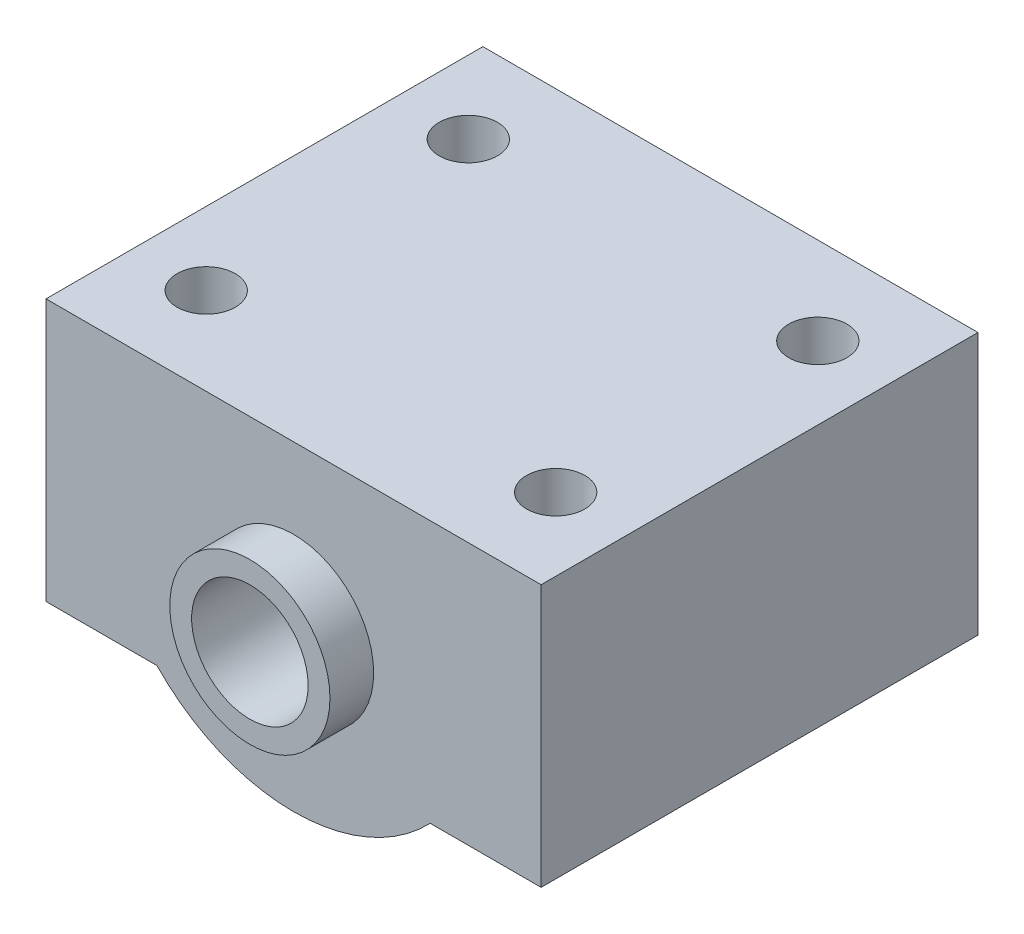
ISO-10303-21;
HEADER;
FILE_DESCRIPTION(('STEP AP214'),'2;1');
FILE_NAME('part.step','',(''),(''),'','','');
FILE_SCHEMA(('AUTOMOTIVE_DESIGN { 1 0 10303 214 1 1 1 1 }'));
ENDSEC;
DATA;
#1=APPLICATION_CONTEXT('core data for automotive mechanical design processes');
#2=APPLICATION_PROTOCOL_DEFINITION('international standard','automotive_design',2000,#1);
#3=PRODUCT_CONTEXT('',#1,'mechanical');
#4=PRODUCT('Part','Part','',(#3));
#5=PRODUCT_RELATED_PRODUCT_CATEGORY('part','',(#4));
#6=PRODUCT_DEFINITION_FORMATION('','',#4);
#7=PRODUCT_DEFINITION_CONTEXT('part definition',#1,'design');
#8=PRODUCT_DEFINITION('design','',#6,#7);
#9=PRODUCT_DEFINITION_SHAPE('','',#8);
#10=(LENGTH_UNIT() NAMED_UNIT(*) SI_UNIT(.MILLI.,.METRE.));
#11=(NAMED_UNIT(*) PLANE_ANGLE_UNIT() SI_UNIT($,.RADIAN.));
#12=(NAMED_UNIT(*) SI_UNIT($,.STERADIAN.) SOLID_ANGLE_UNIT());
#13=UNCERTAINTY_MEASURE_WITH_UNIT(LENGTH_MEASURE(1.E-05),#10,'distance_accuracy_value','');
#14=(GEOMETRIC_REPRESENTATION_CONTEXT(3) GLOBAL_UNCERTAINTY_ASSIGNED_CONTEXT((#13)) GLOBAL_UNIT_ASSIGNED_CONTEXT((#10,
#11,#12)) REPRESENTATION_CONTEXT('',''));
#15=CARTESIAN_POINT('',(0.,0.,0.));
#16=DIRECTION('',(0.,0.,1.));
#17=DIRECTION('',(1.,0.,0.));
#18=AXIS2_PLACEMENT_3D('',#15,#16,#17);
#19=CARTESIAN_POINT('',(0.,0.,0.));
#20=DIRECTION('',(0.,0.,1.));
#21=DIRECTION('',(1.,0.,0.));
#22=AXIS2_PLACEMENT_3D('',#19,#20,#21);
#23=PLANE('',#22);
#24=DIRECTION('',(0.,-1.,0.));
#25=VECTOR('',#24,1.);
#26=CARTESIAN_POINT('',(-17.,-9.,0.));
#27=LINE('',#26,#25);
#28=CARTESIAN_POINT('',(-17.,9.,0.));
#29=VERTEX_POINT('',#28);
#30=CARTESIAN_POINT('',(-17.,-9.,0.));
#31=VERTEX_POINT('',#30);
#32=EDGE_CURVE('E123',#29,#31,#27,.T.);
#33=ORIENTED_EDGE('',*,*,#32,.F.);
#34=DIRECTION('',(-1.,0.,0.));
#35=VECTOR('',#34,1.);
#36=CARTESIAN_POINT('',(17.,9.,0.));
#37=LINE('',#36,#35);
#38=CARTESIAN_POINT('',(17.,9.,0.));
#39=VERTEX_POINT('',#38);
#40=EDGE_CURVE('E82',#39,#29,#37,.T.);
#41=ORIENTED_EDGE('',*,*,#40,.F.);
#42=DIRECTION('',(0.,1.,0.));
#43=VECTOR('',#42,1.);
#44=CARTESIAN_POINT('',(17.,-9.,0.));
#45=LINE('',#44,#43);
#46=CARTESIAN_POINT('',(17.,-9.,0.));
#47=VERTEX_POINT('',#46);
#48=EDGE_CURVE('E76',#47,#39,#45,.T.);
#49=ORIENTED_EDGE('',*,*,#48,.F.);
#50=DIRECTION('',(1.,0.,0.));
#51=VECTOR('',#50,1.);
#52=CARTESIAN_POINT('',(17.,-9.,0.));
#53=LINE('',#52,#51);
#54=CARTESIAN_POINT('',(9.38083151964686,-9.,0.));
#55=VERTEX_POINT('',#54);
#56=EDGE_CURVE('E113',#55,#47,#53,.T.);
#57=ORIENTED_EDGE('',*,*,#56,.F.);
#58=CARTESIAN_POINT('',(0.,0.,0.));
#59=DIRECTION('',(0.,0.,1.));
#60=DIRECTION('',(1.,0.,0.));
#61=AXIS2_PLACEMENT_3D('',#58,#59,#60);
#62=CIRCLE('',#61,13.);
#63=CARTESIAN_POINT('',(-9.38083151964686,-9.,0.));
#64=VERTEX_POINT('',#63);
#65=EDGE_CURVE('E129',#64,#55,#62,.T.);
#66=ORIENTED_EDGE('',*,*,#65,.F.);
#67=DIRECTION('',(1.,0.,0.));
#68=VECTOR('',#67,1.);
#69=CARTESIAN_POINT('',(-9.38083151964685,-9.,0.));
#70=LINE('',#69,#68);
#71=EDGE_CURVE('E126',#31,#64,#70,.T.);
#72=ORIENTED_EDGE('',*,*,#71,.F.);
#73=EDGE_LOOP('',(#33,#41,#49,#57,#66,#72));
#74=FACE_BOUND('',#73,.T.);
#75=CARTESIAN_POINT('',(0.,-2.,0.));
#76=DIRECTION('',(0.,0.,1.));
#77=DIRECTION('',(1.,0.,0.));
#78=AXIS2_PLACEMENT_3D('',#75,#76,#77);
#79=CIRCLE('',#78,5.5);
#80=CARTESIAN_POINT('',(5.5,-2.,0.));
#81=VERTEX_POINT('',#80);
#82=EDGE_CURVE('E11',#81,#81,#79,.F.);
#83=ORIENTED_EDGE('',*,*,#82,.F.);
#84=EDGE_LOOP('',(#83));
#85=FACE_BOUND('',#84,.T.);
#86=ADVANCED_FACE('F36',(#74,#85),#23,.F.);
#87=CARTESIAN_POINT('',(0.,0.,30.));
#88=DIRECTION('',(0.,0.,1.));
#89=DIRECTION('',(1.,0.,0.));
#90=AXIS2_PLACEMENT_3D('',#87,#88,#89);
#91=PLANE('',#90);
#92=DIRECTION('',(0.,-1.,0.));
#93=VECTOR('',#92,1.);
#94=CARTESIAN_POINT('',(-17.,-9.,30.));
#95=LINE('',#94,#93);
#96=CARTESIAN_POINT('',(-17.,9.,30.));
#97=VERTEX_POINT('',#96);
#98=CARTESIAN_POINT('',(-17.,-9.,30.));
#99=VERTEX_POINT('',#98);
#100=EDGE_CURVE('E134',#97,#99,#95,.T.);
#101=ORIENTED_EDGE('',*,*,#100,.T.);
#102=DIRECTION('',(1.,0.,0.));
#103=VECTOR('',#102,1.);
#104=CARTESIAN_POINT('',(-9.38083151964685,-9.,30.));
#105=LINE('',#104,#103);
#106=CARTESIAN_POINT('',(-9.38083151964686,-9.,30.));
#107=VERTEX_POINT('',#106);
#108=EDGE_CURVE('E91',#99,#107,#105,.T.);
#109=ORIENTED_EDGE('',*,*,#108,.T.);
#110=CARTESIAN_POINT('',(0.,0.,30.));
#111=DIRECTION('',(0.,0.,1.));
#112=DIRECTION('',(1.,0.,0.));
#113=AXIS2_PLACEMENT_3D('',#110,#111,#112);
#114=CIRCLE('',#113,13.);
#115=CARTESIAN_POINT('',(9.38083151964686,-9.,30.));
#116=VERTEX_POINT('',#115);
#117=EDGE_CURVE('E105',#107,#116,#114,.T.);
#118=ORIENTED_EDGE('',*,*,#117,.T.);
#119=DIRECTION('',(1.,0.,0.));
#120=VECTOR('',#119,1.);
#121=CARTESIAN_POINT('',(17.,-9.,30.));
#122=LINE('',#121,#120);
#123=CARTESIAN_POINT('',(17.,-9.,30.));
#124=VERTEX_POINT('',#123);
#125=EDGE_CURVE('E98',#116,#124,#122,.T.);
#126=ORIENTED_EDGE('',*,*,#125,.T.);
#127=DIRECTION('',(0.,1.,0.));
#128=VECTOR('',#127,1.);
#129=CARTESIAN_POINT('',(17.,-9.,30.));
#130=LINE('',#129,#128);
#131=CARTESIAN_POINT('',(17.,9.,30.));
#132=VERTEX_POINT('',#131);
#133=EDGE_CURVE('E103',#124,#132,#130,.T.);
#134=ORIENTED_EDGE('',*,*,#133,.T.);
#135=DIRECTION('',(-1.,0.,0.));
#136=VECTOR('',#135,1.);
#137=CARTESIAN_POINT('',(17.,9.,30.));
#138=LINE('',#137,#136);
#139=EDGE_CURVE('E53',#132,#97,#138,.T.);
#140=ORIENTED_EDGE('',*,*,#139,.T.);
#141=EDGE_LOOP('',(#101,#109,#118,#126,#134,#140));
#142=FACE_BOUND('',#141,.T.);
#143=CARTESIAN_POINT('',(0.,-2.,30.));
#144=DIRECTION('',(0.,0.,1.));
#145=DIRECTION('',(1.,0.,0.));
#146=AXIS2_PLACEMENT_3D('',#143,#144,#145);
#147=CIRCLE('',#146,5.5);
#148=CARTESIAN_POINT('',(5.5,-2.,30.));
#149=VERTEX_POINT('',#148);
#150=EDGE_CURVE('E153',#149,#149,#147,.T.);
#151=ORIENTED_EDGE('',*,*,#150,.F.);
#152=EDGE_LOOP('',(#151));
#153=FACE_BOUND('',#152,.T.);
#154=ADVANCED_FACE('F100',(#142,#153),#91,.T.);
#155=CARTESIAN_POINT('',(-17.,-9.,30.));
#156=DIRECTION('',(1.,0.,0.));
#157=DIRECTION('',(0.,0.,-1.));
#158=AXIS2_PLACEMENT_3D('',#155,#156,#157);
#159=PLANE('',#158);
#160=ORIENTED_EDGE('',*,*,#32,.T.);
#161=DIRECTION('',(0.,0.,-1.));
#162=VECTOR('',#161,1.);
#163=CARTESIAN_POINT('',(-17.,-9.,30.));
#164=LINE('',#163,#162);
#165=EDGE_CURVE('E45',#99,#31,#164,.T.);
#166=ORIENTED_EDGE('',*,*,#165,.F.);
#167=ORIENTED_EDGE('',*,*,#100,.F.);
#168=DIRECTION('',(0.,0.,-1.));
#169=VECTOR('',#168,1.);
#170=CARTESIAN_POINT('',(-17.,9.,30.));
#171=LINE('',#170,#169);
#172=EDGE_CURVE('E119',#97,#29,#171,.T.);
#173=ORIENTED_EDGE('',*,*,#172,.T.);
#174=EDGE_LOOP('',(#160,#166,#167,#173));
#175=FACE_BOUND('',#174,.T.);
#176=ADVANCED_FACE('F38',(#175),#159,.F.);
#177=CARTESIAN_POINT('',(-9.38083151964685,-9.,30.));
#178=DIRECTION('',(0.,1.,0.));
#179=DIRECTION('',(0.,0.,1.));
#180=AXIS2_PLACEMENT_3D('',#177,#178,#179);
#181=PLANE('',#180);
#182=CARTESIAN_POINT('',(-12.,-9.,3.));
#183=DIRECTION('',(0.,-1.,0.));
#184=DIRECTION('',(0.,0.,1.));
#185=AXIS2_PLACEMENT_3D('',#182,#183,#184);
#186=CIRCLE('',#185,1.7);
#187=CARTESIAN_POINT('',(-12.,-9.,4.7));
#188=VERTEX_POINT('',#187);
#189=EDGE_CURVE('E210',#188,#188,#186,.T.);
#190=ORIENTED_EDGE('',*,*,#189,.F.);
#191=EDGE_LOOP('',(#190));
#192=FACE_BOUND('',#191,.T.);
#193=CARTESIAN_POINT('',(-12.,-9.,27.));
#194=DIRECTION('',(0.,-1.,0.));
#195=DIRECTION('',(0.,0.,-1.));
#196=AXIS2_PLACEMENT_3D('',#193,#194,#195);
#197=CIRCLE('',#196,1.7);
#198=CARTESIAN_POINT('',(-12.,-9.,25.3));
#199=VERTEX_POINT('',#198);
#200=EDGE_CURVE('E192',#199,#199,#197,.T.);
#201=ORIENTED_EDGE('',*,*,#200,.F.);
#202=EDGE_LOOP('',(#201));
#203=FACE_BOUND('',#202,.T.);
#204=ORIENTED_EDGE('',*,*,#71,.T.);
#205=DIRECTION('',(0.,0.,-1.));
#206=VECTOR('',#205,1.);
#207=CARTESIAN_POINT('',(-9.38083151964686,-9.,30.));
#208=LINE('',#207,#206);
#209=EDGE_CURVE('E138',#107,#64,#208,.T.);
#210=ORIENTED_EDGE('',*,*,#209,.F.);
#211=ORIENTED_EDGE('',*,*,#108,.F.);
#212=ORIENTED_EDGE('',*,*,#165,.T.);
#213=EDGE_LOOP('',(#204,#210,#211,#212));
#214=FACE_BOUND('',#213,.T.);
#215=ADVANCED_FACE('F141',(#192,#203,#214),#181,.F.);
#216=CARTESIAN_POINT('',(0.,0.,30.));
#217=DIRECTION('',(0.,0.,-1.));
#218=DIRECTION('',(-1.,0.,0.));
#219=AXIS2_PLACEMENT_3D('',#216,#217,#218);
#220=CYLINDRICAL_SURFACE('',#219,13.);
#221=ORIENTED_EDGE('',*,*,#65,.T.);
#222=DIRECTION('',(0.,0.,-1.));
#223=VECTOR('',#222,1.);
#224=CARTESIAN_POINT('',(9.38083151964686,-9.,30.));
#225=LINE('',#224,#223);
#226=EDGE_CURVE('E114',#116,#55,#225,.T.);
#227=ORIENTED_EDGE('',*,*,#226,.F.);
#228=ORIENTED_EDGE('',*,*,#117,.F.);
#229=ORIENTED_EDGE('',*,*,#209,.T.);
#230=EDGE_LOOP('',(#221,#227,#228,#229));
#231=FACE_BOUND('',#230,.T.);
#232=ADVANCED_FACE('F149',(#231),#220,.T.);
#233=CARTESIAN_POINT('',(17.,-9.,30.));
#234=DIRECTION('',(0.,1.,0.));
#235=DIRECTION('',(-1.,0.,0.));
#236=AXIS2_PLACEMENT_3D('',#233,#234,#235);
#237=PLANE('',#236);
#238=CARTESIAN_POINT('',(12.,-9.,27.));
#239=DIRECTION('',(0.,-1.,0.));
#240=DIRECTION('',(0.,0.,1.));
#241=AXIS2_PLACEMENT_3D('',#238,#239,#240);
#242=CIRCLE('',#241,1.7);
#243=CARTESIAN_POINT('',(12.,-9.,28.7));
#244=VERTEX_POINT('',#243);
#245=EDGE_CURVE('E198',#244,#244,#242,.T.);
#246=ORIENTED_EDGE('',*,*,#245,.F.);
#247=EDGE_LOOP('',(#246));
#248=FACE_BOUND('',#247,.T.);
#249=CARTESIAN_POINT('',(12.,-9.,3.));
#250=DIRECTION('',(0.,-1.,0.));
#251=DIRECTION('',(0.,0.,-1.));
#252=AXIS2_PLACEMENT_3D('',#249,#250,#251);
#253=CIRCLE('',#252,1.7);
#254=CARTESIAN_POINT('',(12.,-9.,1.3));
#255=VERTEX_POINT('',#254);
#256=EDGE_CURVE('E204',#255,#255,#253,.T.);
#257=ORIENTED_EDGE('',*,*,#256,.F.);
#258=EDGE_LOOP('',(#257));
#259=FACE_BOUND('',#258,.T.);
#260=ORIENTED_EDGE('',*,*,#56,.T.);
#261=DIRECTION('',(0.,0.,-1.));
#262=VECTOR('',#261,1.);
#263=CARTESIAN_POINT('',(17.,-9.,30.));
#264=LINE('',#263,#262);
#265=EDGE_CURVE('E110',#124,#47,#264,.T.);
#266=ORIENTED_EDGE('',*,*,#265,.F.);
#267=ORIENTED_EDGE('',*,*,#125,.F.);
#268=ORIENTED_EDGE('',*,*,#226,.T.);
#269=EDGE_LOOP('',(#260,#266,#267,#268));
#270=FACE_BOUND('',#269,.T.);
#271=ADVANCED_FACE('F111',(#248,#259,#270),#237,.F.);
#272=CARTESIAN_POINT('',(17.,-9.,30.));
#273=DIRECTION('',(-1.,0.,0.));
#274=DIRECTION('',(0.,0.,1.));
#275=AXIS2_PLACEMENT_3D('',#272,#273,#274);
#276=PLANE('',#275);
#277=ORIENTED_EDGE('',*,*,#48,.T.);
#278=DIRECTION('',(0.,0.,-1.));
#279=VECTOR('',#278,1.);
#280=CARTESIAN_POINT('',(17.,9.,30.));
#281=LINE('',#280,#279);
#282=EDGE_CURVE('E115',#132,#39,#281,.T.);
#283=ORIENTED_EDGE('',*,*,#282,.F.);
#284=ORIENTED_EDGE('',*,*,#133,.F.);
#285=ORIENTED_EDGE('',*,*,#265,.T.);
#286=EDGE_LOOP('',(#277,#283,#284,#285));
#287=FACE_BOUND('',#286,.T.);
#288=ADVANCED_FACE('F117',(#287),#276,.F.);
#289=CARTESIAN_POINT('',(17.,9.,30.));
#290=DIRECTION('',(0.,-1.,0.));
#291=DIRECTION('',(1.,0.,0.));
#292=AXIS2_PLACEMENT_3D('',#289,#290,#291);
#293=PLANE('',#292);
#294=CARTESIAN_POINT('',(12.,9.,6.));
#295=DIRECTION('',(0.,1.,0.));
#296=DIRECTION('',(1.,0.,0.));
#297=AXIS2_PLACEMENT_3D('',#294,#295,#296);
#298=CIRCLE('',#297,2.);
#299=CARTESIAN_POINT('',(14.,9.,6.));
#300=VERTEX_POINT('',#299);
#301=EDGE_CURVE('E174',#300,#300,#298,.T.);
#302=ORIENTED_EDGE('',*,*,#301,.F.);
#303=EDGE_LOOP('',(#302));
#304=FACE_BOUND('',#303,.T.);
#305=CARTESIAN_POINT('',(12.,9.,24.));
#306=DIRECTION('',(0.,1.,0.));
#307=DIRECTION('',(-1.,0.,0.));
#308=AXIS2_PLACEMENT_3D('',#305,#306,#307);
#309=CIRCLE('',#308,2.);
#310=CARTESIAN_POINT('',(10.,9.,24.));
#311=VERTEX_POINT('',#310);
#312=EDGE_CURVE('E181',#311,#311,#309,.T.);
#313=ORIENTED_EDGE('',*,*,#312,.F.);
#314=EDGE_LOOP('',(#313));
#315=FACE_BOUND('',#314,.T.);
#316=CARTESIAN_POINT('',(-12.,9.,24.));
#317=DIRECTION('',(0.,1.,0.));
#318=DIRECTION('',(1.,0.,0.));
#319=AXIS2_PLACEMENT_3D('',#316,#317,#318);
#320=CIRCLE('',#319,2.);
#321=CARTESIAN_POINT('',(-10.,9.,24.));
#322=VERTEX_POINT('',#321);
#323=EDGE_CURVE('E187',#322,#322,#320,.T.);
#324=ORIENTED_EDGE('',*,*,#323,.F.);
#325=EDGE_LOOP('',(#324));
#326=FACE_BOUND('',#325,.T.);
#327=CARTESIAN_POINT('',(-12.,9.,6.));
#328=DIRECTION('',(0.,1.,0.));
#329=DIRECTION('',(-1.,0.,0.));
#330=AXIS2_PLACEMENT_3D('',#327,#328,#329);
#331=CIRCLE('',#330,2.);
#332=CARTESIAN_POINT('',(-14.,9.,6.));
#333=VERTEX_POINT('',#332);
#334=EDGE_CURVE('E168',#333,#333,#331,.T.);
#335=ORIENTED_EDGE('',*,*,#334,.F.);
#336=EDGE_LOOP('',(#335));
#337=FACE_BOUND('',#336,.T.);
#338=ORIENTED_EDGE('',*,*,#40,.T.);
#339=ORIENTED_EDGE('',*,*,#172,.F.);
#340=ORIENTED_EDGE('',*,*,#139,.F.);
#341=ORIENTED_EDGE('',*,*,#282,.T.);
#342=EDGE_LOOP('',(#338,#339,#340,#341));
#343=FACE_BOUND('',#342,.T.);
#344=ADVANCED_FACE('F253',(#304,#315,#326,#337,#343),#293,.F.);
#345=CARTESIAN_POINT('',(0.,-2.,-0.001000000000001));
#346=DIRECTION('',(0.,0.,1.));
#347=DIRECTION('',(1.,0.,0.));
#348=AXIS2_PLACEMENT_3D('',#345,#346,#347);
#349=CYLINDRICAL_SURFACE('',#348,4.);
#350=CARTESIAN_POINT('',(0.,-2.,33.));
#351=DIRECTION('',(0.,0.,1.));
#352=DIRECTION('',(1.,0.,0.));
#353=AXIS2_PLACEMENT_3D('',#350,#351,#352);
#354=CIRCLE('',#353,4.);
#355=CARTESIAN_POINT('',(4.,-2.,33.));
#356=VERTEX_POINT('',#355);
#357=EDGE_CURVE('E156',#356,#356,#354,.T.);
#358=ORIENTED_EDGE('',*,*,#357,.T.);
#359=EDGE_LOOP('',(#358));
#360=FACE_BOUND('',#359,.T.);
#361=CARTESIAN_POINT('',(0.,-2.,-3.));
#362=DIRECTION('',(0.,0.,-1.));
#363=DIRECTION('',(-1.,0.,0.));
#364=AXIS2_PLACEMENT_3D('',#361,#362,#363);
#365=CIRCLE('',#364,4.);
#366=CARTESIAN_POINT('',(-4.,-2.,-3.));
#367=VERTEX_POINT('',#366);
#368=EDGE_CURVE('E164',#367,#367,#365,.T.);
#369=ORIENTED_EDGE('',*,*,#368,.T.);
#370=EDGE_LOOP('',(#369));
#371=FACE_BOUND('',#370,.T.);
#372=ADVANCED_FACE('F256',(#360,#371),#349,.F.);
#373=CARTESIAN_POINT('',(0.,-2.,33.));
#374=DIRECTION('',(0.,0.,1.));
#375=DIRECTION('',(1.,0.,0.));
#376=AXIS2_PLACEMENT_3D('',#373,#374,#375);
#377=PLANE('',#376);
#378=CARTESIAN_POINT('',(0.,-2.,33.));
#379=DIRECTION('',(0.,0.,1.));
#380=DIRECTION('',(1.,0.,0.));
#381=AXIS2_PLACEMENT_3D('',#378,#379,#380);
#382=CIRCLE('',#381,5.5);
#383=CARTESIAN_POINT('',(5.5,-2.,33.));
#384=VERTEX_POINT('',#383);
#385=EDGE_CURVE('E127',#384,#384,#382,.T.);
#386=ORIENTED_EDGE('',*,*,#385,.T.);
#387=EDGE_LOOP('',(#386));
#388=FACE_BOUND('',#387,.T.);
#389=ORIENTED_EDGE('',*,*,#357,.F.);
#390=EDGE_LOOP('',(#389));
#391=FACE_BOUND('',#390,.T.);
#392=ADVANCED_FACE('F292',(#388,#391),#377,.T.);
#393=CARTESIAN_POINT('',(0.,-2.,33.));
#394=DIRECTION('',(0.,0.,-1.));
#395=DIRECTION('',(-1.,0.,0.));
#396=AXIS2_PLACEMENT_3D('',#393,#394,#395);
#397=CYLINDRICAL_SURFACE('',#396,5.5);
#398=ORIENTED_EDGE('',*,*,#385,.F.);
#399=EDGE_LOOP('',(#398));
#400=FACE_BOUND('',#399,.T.);
#401=ORIENTED_EDGE('',*,*,#150,.T.);
#402=EDGE_LOOP('',(#401));
#403=FACE_BOUND('',#402,.T.);
#404=ADVANCED_FACE('F300',(#400,#403),#397,.T.);
#405=CARTESIAN_POINT('',(0.,-2.,-3.));
#406=DIRECTION('',(0.,0.,-1.));
#407=DIRECTION('',(-1.,0.,0.));
#408=AXIS2_PLACEMENT_3D('',#405,#406,#407);
#409=PLANE('',#408);
#410=CARTESIAN_POINT('',(0.,-2.,-3.));
#411=DIRECTION('',(0.,0.,-1.));
#412=DIRECTION('',(-1.,0.,0.));
#413=AXIS2_PLACEMENT_3D('',#410,#411,#412);
#414=CIRCLE('',#413,5.5);
#415=CARTESIAN_POINT('',(-5.5,-2.,-3.));
#416=VERTEX_POINT('',#415);
#417=EDGE_CURVE('E161',#416,#416,#414,.T.);
#418=ORIENTED_EDGE('',*,*,#417,.T.);
#419=EDGE_LOOP('',(#418));
#420=FACE_BOUND('',#419,.T.);
#421=ORIENTED_EDGE('',*,*,#368,.F.);
#422=EDGE_LOOP('',(#421));
#423=FACE_BOUND('',#422,.T.);
#424=ADVANCED_FACE('F308',(#420,#423),#409,.T.);
#425=CARTESIAN_POINT('',(0.,-2.,-3.));
#426=DIRECTION('',(0.,0.,1.));
#427=DIRECTION('',(1.,0.,0.));
#428=AXIS2_PLACEMENT_3D('',#425,#426,#427);
#429=CYLINDRICAL_SURFACE('',#428,5.5);
#430=ORIENTED_EDGE('',*,*,#417,.F.);
#431=EDGE_LOOP('',(#430));
#432=FACE_BOUND('',#431,.T.);
#433=ORIENTED_EDGE('',*,*,#82,.T.);
#434=EDGE_LOOP('',(#433));
#435=FACE_BOUND('',#434,.T.);
#436=ADVANCED_FACE('F315',(#432,#435),#429,.T.);
#437=CARTESIAN_POINT('',(-12.,3.,6.));
#438=DIRECTION('',(0.,1.,0.));
#439=DIRECTION('',(-1.,0.,0.));
#440=AXIS2_PLACEMENT_3D('',#437,#438,#439);
#441=CYLINDRICAL_SURFACE('',#440,2.);
#442=CARTESIAN_POINT('',(-12.,3.,6.));
#443=DIRECTION('',(0.,1.,0.));
#444=DIRECTION('',(-1.,0.,0.));
#445=AXIS2_PLACEMENT_3D('',#442,#443,#444);
#446=CIRCLE('',#445,2.);
#447=CARTESIAN_POINT('',(-14.,3.,6.));
#448=VERTEX_POINT('',#447);
#449=EDGE_CURVE('E167',#448,#448,#446,.T.);
#450=ORIENTED_EDGE('',*,*,#449,.F.);
#451=EDGE_LOOP('',(#450));
#452=FACE_BOUND('',#451,.T.);
#453=ORIENTED_EDGE('',*,*,#334,.T.);
#454=EDGE_LOOP('',(#453));
#455=FACE_BOUND('',#454,.T.);
#456=ADVANCED_FACE('F322',(#452,#455),#441,.F.);
#457=CARTESIAN_POINT('',(-12.,3.,6.));
#458=DIRECTION('',(0.,1.,0.));
#459=DIRECTION('',(-1.,0.,0.));
#460=AXIS2_PLACEMENT_3D('',#457,#458,#459);
#461=PLANE('',#460);
#462=ORIENTED_EDGE('',*,*,#449,.T.);
#463=EDGE_LOOP('',(#462));
#464=FACE_BOUND('',#463,.T.);
#465=ADVANCED_FACE('F329',(#464),#461,.T.);
#466=CARTESIAN_POINT('',(-12.,3.,24.));
#467=DIRECTION('',(0.,1.,0.));
#468=DIRECTION('',(-1.,0.,0.));
#469=AXIS2_PLACEMENT_3D('',#466,#467,#468);
#470=CYLINDRICAL_SURFACE('',#469,2.);
#471=CARTESIAN_POINT('',(-12.,3.,24.));
#472=DIRECTION('',(0.,1.,0.));
#473=DIRECTION('',(1.,0.,0.));
#474=AXIS2_PLACEMENT_3D('',#471,#472,#473);
#475=CIRCLE('',#474,2.);
#476=CARTESIAN_POINT('',(-10.,3.,24.));
#477=VERTEX_POINT('',#476);
#478=EDGE_CURVE('E171',#477,#477,#475,.T.);
#479=ORIENTED_EDGE('',*,*,#478,.F.);
#480=EDGE_LOOP('',(#479));
#481=FACE_BOUND('',#480,.T.);
#482=ORIENTED_EDGE('',*,*,#323,.T.);
#483=EDGE_LOOP('',(#482));
#484=FACE_BOUND('',#483,.T.);
#485=ADVANCED_FACE('F337',(#481,#484),#470,.F.);
#486=CARTESIAN_POINT('',(-12.,3.,24.));
#487=DIRECTION('',(0.,-1.,0.));
#488=DIRECTION('',(1.,0.,0.));
#489=AXIS2_PLACEMENT_3D('',#486,#487,#488);
#490=PLANE('',#489);
#491=ORIENTED_EDGE('',*,*,#478,.T.);
#492=EDGE_LOOP('',(#491));
#493=FACE_BOUND('',#492,.T.);
#494=ADVANCED_FACE('F345',(#493),#490,.F.);
#495=CARTESIAN_POINT('',(12.,3.,24.));
#496=DIRECTION('',(0.,1.,0.));
#497=DIRECTION('',(-1.,0.,0.));
#498=AXIS2_PLACEMENT_3D('',#495,#496,#497);
#499=CYLINDRICAL_SURFACE('',#498,2.);
#500=CARTESIAN_POINT('',(12.,3.,24.));
#501=DIRECTION('',(0.,1.,0.));
#502=DIRECTION('',(-1.,0.,0.));
#503=AXIS2_PLACEMENT_3D('',#500,#501,#502);
#504=CIRCLE('',#503,2.);
#505=CARTESIAN_POINT('',(10.,3.,24.));
#506=VERTEX_POINT('',#505);
#507=EDGE_CURVE('E184',#506,#506,#504,.T.);
#508=ORIENTED_EDGE('',*,*,#507,.F.);
#509=EDGE_LOOP('',(#508));
#510=FACE_BOUND('',#509,.T.);
#511=ORIENTED_EDGE('',*,*,#312,.T.);
#512=EDGE_LOOP('',(#511));
#513=FACE_BOUND('',#512,.T.);
#514=ADVANCED_FACE('F353',(#510,#513),#499,.F.);
#515=CARTESIAN_POINT('',(12.,3.,24.));
#516=DIRECTION('',(0.,1.,0.));
#517=DIRECTION('',(-1.,0.,0.));
#518=AXIS2_PLACEMENT_3D('',#515,#516,#517);
#519=PLANE('',#518);
#520=ORIENTED_EDGE('',*,*,#507,.T.);
#521=EDGE_LOOP('',(#520));
#522=FACE_BOUND('',#521,.T.);
#523=ADVANCED_FACE('F360',(#522),#519,.T.);
#524=CARTESIAN_POINT('',(12.,3.,6.));
#525=DIRECTION('',(0.,1.,0.));
#526=DIRECTION('',(-1.,0.,0.));
#527=AXIS2_PLACEMENT_3D('',#524,#525,#526);
#528=CYLINDRICAL_SURFACE('',#527,2.);
#529=CARTESIAN_POINT('',(12.,3.,6.));
#530=DIRECTION('',(0.,1.,0.));
#531=DIRECTION('',(1.,0.,0.));
#532=AXIS2_PLACEMENT_3D('',#529,#530,#531);
#533=CIRCLE('',#532,2.);
#534=CARTESIAN_POINT('',(14.,3.,6.));
#535=VERTEX_POINT('',#534);
#536=EDGE_CURVE('E177',#535,#535,#533,.T.);
#537=ORIENTED_EDGE('',*,*,#536,.F.);
#538=EDGE_LOOP('',(#537));
#539=FACE_BOUND('',#538,.T.);
#540=ORIENTED_EDGE('',*,*,#301,.T.);
#541=EDGE_LOOP('',(#540));
#542=FACE_BOUND('',#541,.T.);
#543=ADVANCED_FACE('F368',(#539,#542),#528,.F.);
#544=CARTESIAN_POINT('',(12.,3.,6.));
#545=DIRECTION('',(0.,-1.,0.));
#546=DIRECTION('',(1.,0.,0.));
#547=AXIS2_PLACEMENT_3D('',#544,#545,#546);
#548=PLANE('',#547);
#549=ORIENTED_EDGE('',*,*,#536,.T.);
#550=EDGE_LOOP('',(#549));
#551=FACE_BOUND('',#550,.T.);
#552=ADVANCED_FACE('F376',(#551),#548,.F.);
#553=CARTESIAN_POINT('',(12.,0.999999999999999,3.));
#554=DIRECTION('',(0.,-1.,0.));
#555=DIRECTION('',(0.,0.,-1.));
#556=AXIS2_PLACEMENT_3D('',#553,#554,#555);
#557=CYLINDRICAL_SURFACE('',#556,1.7);
#558=CARTESIAN_POINT('',(12.,0.999999999999999,3.));
#559=DIRECTION('',(0.,-1.,0.));
#560=DIRECTION('',(0.,0.,-1.));
#561=AXIS2_PLACEMENT_3D('',#558,#559,#560);
#562=CIRCLE('',#561,1.7);
#563=CARTESIAN_POINT('',(12.,0.999999999999999,1.3));
#564=VERTEX_POINT('',#563);
#565=EDGE_CURVE('E207',#564,#564,#562,.T.);
#566=ORIENTED_EDGE('',*,*,#565,.F.);
#567=EDGE_LOOP('',(#566));
#568=FACE_BOUND('',#567,.T.);
#569=ORIENTED_EDGE('',*,*,#256,.T.);
#570=EDGE_LOOP('',(#569));
#571=FACE_BOUND('',#570,.T.);
#572=ADVANCED_FACE('F384',(#568,#571),#557,.F.);
#573=CARTESIAN_POINT('',(12.,0.999999999999999,3.));
#574=DIRECTION('',(0.,-1.,0.));
#575=DIRECTION('',(0.,0.,-1.));
#576=AXIS2_PLACEMENT_3D('',#573,#574,#575);
#577=PLANE('',#576);
#578=ORIENTED_EDGE('',*,*,#565,.T.);
#579=EDGE_LOOP('',(#578));
#580=FACE_BOUND('',#579,.T.);
#581=ADVANCED_FACE('F391',(#580),#577,.T.);
#582=CARTESIAN_POINT('',(12.,0.999999999999999,27.));
#583=DIRECTION('',(0.,-1.,0.));
#584=DIRECTION('',(0.,0.,-1.));
#585=AXIS2_PLACEMENT_3D('',#582,#583,#584);
#586=CYLINDRICAL_SURFACE('',#585,1.7);
#587=CARTESIAN_POINT('',(12.,0.999999999999999,27.));
#588=DIRECTION('',(0.,-1.,0.));
#589=DIRECTION('',(0.,0.,1.));
#590=AXIS2_PLACEMENT_3D('',#587,#588,#589);
#591=CIRCLE('',#590,1.7);
#592=CARTESIAN_POINT('',(12.,0.999999999999999,28.7));
#593=VERTEX_POINT('',#592);
#594=EDGE_CURVE('E201',#593,#593,#591,.T.);
#595=ORIENTED_EDGE('',*,*,#594,.F.);
#596=EDGE_LOOP('',(#595));
#597=FACE_BOUND('',#596,.T.);
#598=ORIENTED_EDGE('',*,*,#245,.T.);
#599=EDGE_LOOP('',(#598));
#600=FACE_BOUND('',#599,.T.);
#601=ADVANCED_FACE('F240',(#597,#600),#586,.F.);
#602=CARTESIAN_POINT('',(12.,0.999999999999999,27.));
#603=DIRECTION('',(0.,1.,0.));
#604=DIRECTION('',(0.,0.,1.));
#605=AXIS2_PLACEMENT_3D('',#602,#603,#604);
#606=PLANE('',#605);
#607=ORIENTED_EDGE('',*,*,#594,.T.);
#608=EDGE_LOOP('',(#607));
#609=FACE_BOUND('',#608,.T.);
#610=ADVANCED_FACE('F231',(#609),#606,.F.);
#611=CARTESIAN_POINT('',(-12.,0.999999999999999,27.));
#612=DIRECTION('',(0.,-1.,0.));
#613=DIRECTION('',(0.,0.,-1.));
#614=AXIS2_PLACEMENT_3D('',#611,#612,#613);
#615=CYLINDRICAL_SURFACE('',#614,1.7);
#616=CARTESIAN_POINT('',(-12.,0.999999999999999,27.));
#617=DIRECTION('',(0.,-1.,0.));
#618=DIRECTION('',(0.,0.,-1.));
#619=AXIS2_PLACEMENT_3D('',#616,#617,#618);
#620=CIRCLE('',#619,1.7);
#621=CARTESIAN_POINT('',(-12.,0.999999999999999,25.3));
#622=VERTEX_POINT('',#621);
#623=EDGE_CURVE('E178',#622,#622,#620,.T.);
#624=ORIENTED_EDGE('',*,*,#623,.F.);
#625=EDGE_LOOP('',(#624));
#626=FACE_BOUND('',#625,.T.);
#627=ORIENTED_EDGE('',*,*,#200,.T.);
#628=EDGE_LOOP('',(#627));
#629=FACE_BOUND('',#628,.T.);
#630=ADVANCED_FACE('F229',(#626,#629),#615,.F.);
#631=CARTESIAN_POINT('',(-12.,0.999999999999999,27.));
#632=DIRECTION('',(0.,-1.,0.));
#633=DIRECTION('',(0.,0.,-1.));
#634=AXIS2_PLACEMENT_3D('',#631,#632,#633);
#635=PLANE('',#634);
#636=ORIENTED_EDGE('',*,*,#623,.T.);
#637=EDGE_LOOP('',(#636));
#638=FACE_BOUND('',#637,.T.);
#639=ADVANCED_FACE('F221',(#638),#635,.T.);
#640=CARTESIAN_POINT('',(-12.,0.999999999999999,3.));
#641=DIRECTION('',(0.,-1.,0.));
#642=DIRECTION('',(0.,0.,-1.));
#643=AXIS2_PLACEMENT_3D('',#640,#641,#642);
#644=CYLINDRICAL_SURFACE('',#643,1.7);
#645=CARTESIAN_POINT('',(-12.,0.999999999999999,3.));
#646=DIRECTION('',(0.,-1.,0.));
#647=DIRECTION('',(0.,0.,1.));
#648=AXIS2_PLACEMENT_3D('',#645,#646,#647);
#649=CIRCLE('',#648,1.7);
#650=CARTESIAN_POINT('',(-12.,0.999999999999999,4.7));
#651=VERTEX_POINT('',#650);
#652=EDGE_CURVE('E195',#651,#651,#649,.T.);
#653=ORIENTED_EDGE('',*,*,#652,.F.);
#654=EDGE_LOOP('',(#653));
#655=FACE_BOUND('',#654,.T.);
#656=ORIENTED_EDGE('',*,*,#189,.T.);
#657=EDGE_LOOP('',(#656));
#658=FACE_BOUND('',#657,.T.);
#659=ADVANCED_FACE('F218',(#655,#658),#644,.F.);
#660=CARTESIAN_POINT('',(-12.,0.999999999999999,3.));
#661=DIRECTION('',(0.,1.,0.));
#662=DIRECTION('',(0.,0.,1.));
#663=AXIS2_PLACEMENT_3D('',#660,#661,#662);
#664=PLANE('',#663);
#665=ORIENTED_EDGE('',*,*,#652,.T.);
#666=EDGE_LOOP('',(#665));
#667=FACE_BOUND('',#666,.T.);
#668=ADVANCED_FACE('F216',(#667),#664,.F.);
#669=CLOSED_SHELL('',(#86,#154,#176,#215,#232,#271,#288,#344,#372,#392,#404,#424,#436,#456,#465,
#485,#494,#514,#523,#543,#552,#572,#581,#601,#610,#630,#639,#659,#668));
#670=MANIFOLD_SOLID_BREP('B2',#669);
#671=ADVANCED_BREP_SHAPE_REPRESENTATION('',(#18,#670),#14);
#672=SHAPE_DEFINITION_REPRESENTATION(#9,#671);
ENDSEC;
END-ISO-10303-21;
